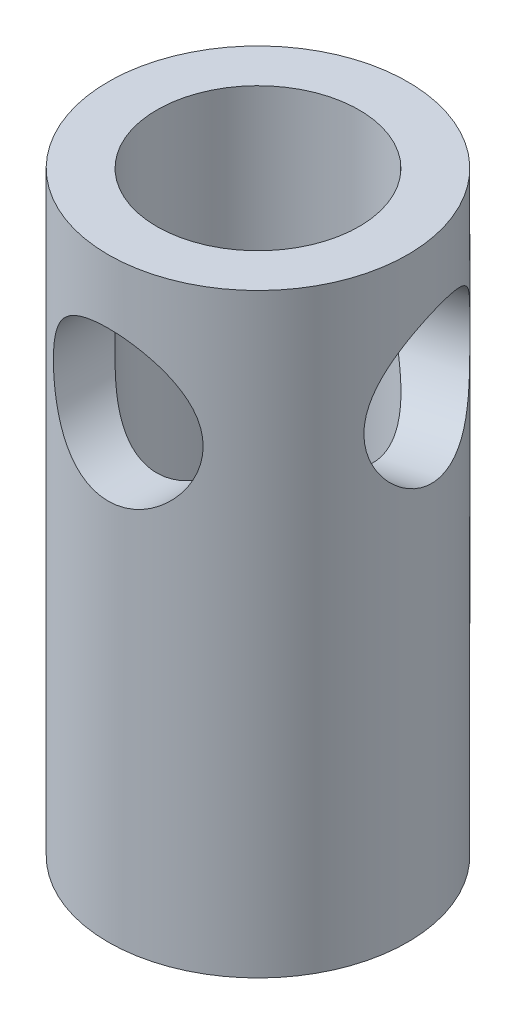
ISO-10303-21;
HEADER;
FILE_DESCRIPTION(('STEP AP214'),'2;1');
FILE_NAME('part.step','',(''),(''),'','','');
FILE_SCHEMA(('AUTOMOTIVE_DESIGN { 1 0 10303 214 1 1 1 1 }'));
ENDSEC;
DATA;
#1=APPLICATION_CONTEXT('core data for automotive mechanical design processes');
#2=APPLICATION_PROTOCOL_DEFINITION('international standard','automotive_design',2000,#1);
#3=PRODUCT_CONTEXT('',#1,'mechanical');
#4=PRODUCT('Part','Part','',(#3));
#5=PRODUCT_RELATED_PRODUCT_CATEGORY('part','',(#4));
#6=PRODUCT_DEFINITION_FORMATION('','',#4);
#7=PRODUCT_DEFINITION_CONTEXT('part definition',#1,'design');
#8=PRODUCT_DEFINITION('design','',#6,#7);
#9=PRODUCT_DEFINITION_SHAPE('','',#8);
#10=(LENGTH_UNIT() NAMED_UNIT(*) SI_UNIT(.MILLI.,.METRE.));
#11=(NAMED_UNIT(*) PLANE_ANGLE_UNIT() SI_UNIT($,.RADIAN.));
#12=(NAMED_UNIT(*) SI_UNIT($,.STERADIAN.) SOLID_ANGLE_UNIT());
#13=UNCERTAINTY_MEASURE_WITH_UNIT(LENGTH_MEASURE(1.E-05),#10,'distance_accuracy_value','');
#14=(GEOMETRIC_REPRESENTATION_CONTEXT(3) GLOBAL_UNCERTAINTY_ASSIGNED_CONTEXT((#13)) GLOBAL_UNIT_ASSIGNED_CONTEXT((#10,
#11,#12)) REPRESENTATION_CONTEXT('',''));
#15=CARTESIAN_POINT('',(0.,0.,0.));
#16=DIRECTION('',(0.,0.,1.));
#17=DIRECTION('',(1.,0.,0.));
#18=AXIS2_PLACEMENT_3D('',#15,#16,#17);
#19=CARTESIAN_POINT('',(0.,7.95,0.));
#20=DIRECTION('',(0.,-1.,0.));
#21=DIRECTION('',(0.,0.,-1.));
#22=AXIS2_PLACEMENT_3D('',#19,#20,#21);
#23=CYLINDRICAL_SURFACE('',#22,4.);
#24=CARTESIAN_POINT('',(0.,7.95,0.));
#25=DIRECTION('',(0.,1.,0.));
#26=DIRECTION('',(0.,0.,1.));
#27=AXIS2_PLACEMENT_3D('',#24,#25,#26);
#28=CIRCLE('',#27,4.);
#29=CARTESIAN_POINT('',(0.,7.95,4.));
#30=VERTEX_POINT('',#29);
#31=EDGE_CURVE('E10',#30,#30,#28,.T.);
#32=ORIENTED_EDGE('',*,*,#31,.F.);
#33=EDGE_LOOP('',(#32));
#34=FACE_BOUND('',#33,.T.);
#35=CARTESIAN_POINT('',(0.,-7.95,0.));
#36=DIRECTION('',(0.,1.,0.));
#37=DIRECTION('',(0.,0.,1.));
#38=AXIS2_PLACEMENT_3D('',#35,#36,#37);
#39=CIRCLE('',#38,4.);
#40=CARTESIAN_POINT('',(0.,-7.95,4.));
#41=VERTEX_POINT('',#40);
#42=EDGE_CURVE('E51',#41,#41,#39,.T.);
#43=ORIENTED_EDGE('',*,*,#42,.T.);
#44=EDGE_LOOP('',(#43));
#45=FACE_BOUND('',#44,.T.);
#46=CARTESIAN_POINT('',(0.,2.25,4.));
#47=CARTESIAN_POINT('',(0.105143925902467,2.25000660463438,3.99999426810082));
#48=CARTESIAN_POINT('',(0.210413199395125,2.25834014624211,3.99580982039513));
#49=CARTESIAN_POINT('',(0.417840470537792,2.29130576068308,3.97948312074314));
#50=CARTESIAN_POINT('',(0.519992173427259,2.31596878599563,3.96732575657839));
#51=CARTESIAN_POINT('',(0.717867089760898,2.38038761723326,3.93632558806751));
#52=CARTESIAN_POINT('',(0.813613605878293,2.42008476849594,3.91750878355075));
#53=CARTESIAN_POINT('',(0.996945233613197,2.51314124272997,3.87491553031523));
#54=CARTESIAN_POINT('',(1.08453098798012,2.56649948849773,3.85113947267051));
#55=CARTESIAN_POINT('',(1.25501563552382,2.68903449897057,3.79912516516124));
#56=CARTESIAN_POINT('',(1.33731042224422,2.75897295847928,3.77070398255074));
#57=CARTESIAN_POINT('',(1.48955888973396,2.91104295849407,3.71319940493486));
#58=CARTESIAN_POINT('',(1.55950316621353,2.99318370354488,3.68411552418069));
#59=CARTESIAN_POINT('',(1.69050400090056,3.17496669904676,3.62597902394695));
#60=CARTESIAN_POINT('',(1.75045067110327,3.27547219669183,3.59710373940264));
#61=CARTESIAN_POINT('',(1.85233645378139,3.48673467197243,3.54571957544641));
#62=CARTESIAN_POINT('',(1.89428842993267,3.5974842574455,3.52320615213979));
#63=CARTESIAN_POINT('',(1.95626488437718,3.81933021084385,3.48915734075617));
#64=CARTESIAN_POINT('',(1.97745171416088,3.93000890413479,3.47704543167427));
#65=CARTESIAN_POINT('',(2.00085398661769,4.15395767555895,3.46363779897055));
#66=CARTESIAN_POINT('',(2.00308817674615,4.26722508174231,3.46233138686576));
#67=CARTESIAN_POINT('',(1.98937457434459,4.47857204863074,3.47021860514497));
#68=CARTESIAN_POINT('',(1.97556911907364,4.5768480624461,3.47817527324027));
#69=CARTESIAN_POINT('',(1.93387969811386,4.76944381874608,3.50152457467701));
#70=CARTESIAN_POINT('',(1.9059912477953,4.86376229061063,3.51691957663553));
#71=CARTESIAN_POINT('',(1.83641956077201,5.04845826513132,3.55374952825482));
#72=CARTESIAN_POINT('',(1.79443013423199,5.13869279757158,3.57531681327997));
#73=CARTESIAN_POINT('',(1.698083375336,5.31126858518002,3.62206808562807));
#74=CARTESIAN_POINT('',(1.64372048762493,5.39360627120018,3.64725369560381));
#75=CARTESIAN_POINT('',(1.51613210982558,5.55904250548645,3.70226315806572));
#76=CARTESIAN_POINT('',(1.44138891673856,5.64091374715232,3.73227020473492));
#77=CARTESIAN_POINT('',(1.27911115748275,5.7914708371818,3.79095246600814));
#78=CARTESIAN_POINT('',(1.19157051314857,5.86015038406777,3.81962703917602));
#79=CARTESIAN_POINT('',(1.0010330116637,5.98537132205945,3.87403974565928));
#80=CARTESIAN_POINT('',(0.897507183198817,6.04120094489148,3.89957968324014));
#81=CARTESIAN_POINT('',(0.680932430977593,6.13419405808602,3.94315762242484));
#82=CARTESIAN_POINT('',(0.567891152530552,6.17137237003033,3.96120157887106));
#83=CARTESIAN_POINT('',(0.345532983321405,6.22295080743335,3.98648667482871));
#84=CARTESIAN_POINT('',(0.236683061096653,6.23898247149356,3.9944987660262));
#85=CARTESIAN_POINT('',(0.0175591998987037,6.25292946226898,4.00146026918207));
#86=CARTESIAN_POINT('',(-0.0927140397398172,6.25085337127894,4.00041397442637));
#87=CARTESIAN_POINT('',(-0.302465943971974,6.22958662316251,3.9898238450687));
#88=CARTESIAN_POINT('',(-0.40211881609986,6.21173493454001,3.98094491376337));
#89=CARTESIAN_POINT('',(-0.596813784603882,6.16152385620976,3.9564434262968));
#90=CARTESIAN_POINT('',(-0.691855371382174,6.12916286709301,3.94082012668824));
#91=CARTESIAN_POINT('',(-0.877777216899145,6.05000306713393,3.90368502827176));
#92=CARTESIAN_POINT('',(-0.968460794011607,6.00281789976743,3.88201763539261));
#93=CARTESIAN_POINT('',(-1.14092272339854,5.89578492870687,3.83487948634835));
#94=CARTESIAN_POINT('',(-1.22269725955318,5.83593173080921,3.80940711133877));
#95=CARTESIAN_POINT('',(-1.38353537857843,5.69847914933857,3.75416442672396));
#96=CARTESIAN_POINT('',(-1.46154415563805,5.61971426310971,3.72421769686998));
#97=CARTESIAN_POINT('',(-1.60371264223771,5.45014969744454,3.6652478321764));
#98=CARTESIAN_POINT('',(-1.66786277142375,5.35934176230416,3.63622534800094));
#99=CARTESIAN_POINT('',(-1.78341582895804,5.16271269165405,3.58102384412979));
#100=CARTESIAN_POINT('',(-1.8340509916005,5.05637746781104,3.55505059178121));
#101=CARTESIAN_POINT('',(-1.91616565186941,4.83497986485007,3.51148144588269));
#102=CARTESIAN_POINT('',(-1.94766983173403,4.71992894706622,3.493874764435));
#103=CARTESIAN_POINT('',(-1.98772337493374,4.49617955423059,3.47123002051604));
#104=CARTESIAN_POINT('',(-1.9981859928109,4.38793149312952,3.4651476693013));
#105=CARTESIAN_POINT('',(-2.0013783087524,4.17110586567095,3.46330709283207));
#106=CARTESIAN_POINT('',(-1.99411569324648,4.06252846252428,3.4675443925278));
#107=CARTESIAN_POINT('',(-1.96385225118662,3.85903299693313,3.48475724102153));
#108=CARTESIAN_POINT('',(-1.94241662868607,3.76379905971052,3.49686188965317));
#109=CARTESIAN_POINT('',(-1.88635071644882,3.57838376115127,3.52742032375305));
#110=CARTESIAN_POINT('',(-1.85171618231984,3.48820403581594,3.54587615139337));
#111=CARTESIAN_POINT('',(-1.76763149060113,3.30875029802693,3.58857060729071));
#112=CARTESIAN_POINT('',(-1.7173422756314,3.21994419634194,3.61311444791841));
#113=CARTESIAN_POINT('',(-1.60430194327478,3.05145092763748,3.66470663269721));
#114=CARTESIAN_POINT('',(-1.54154434248312,2.97176853895778,3.69175627591221));
#115=CARTESIAN_POINT('',(-1.39640665332275,2.81371603529065,3.74924646316184));
#116=CARTESIAN_POINT('',(-1.31256884599452,2.73668179529942,3.77969966613256));
#117=CARTESIAN_POINT('',(-1.13230961246639,2.59747403312946,3.83755504519861));
#118=CARTESIAN_POINT('',(-1.03588144661039,2.53530852106019,3.8649555725239));
#119=CARTESIAN_POINT('',(-0.831863193565891,2.42752727457586,3.91396019133075));
#120=CARTESIAN_POINT('',(-0.724199007553461,2.38203166152706,3.93552192987866));
#121=CARTESIAN_POINT('',(-0.501484202276174,2.31038366448518,3.97002682597974));
#122=CARTESIAN_POINT('',(-0.3864555991782,2.28417630638857,3.98299446726136));
#123=CARTESIAN_POINT('',(-0.22520389298179,2.26220517782852,3.99390923826956));
#124=CARTESIAN_POINT('',(-0.18032375888313,2.25763471826732,3.99618730680502));
#125=CARTESIAN_POINT('',(-0.0903034636101831,2.25153066897183,3.99923393953631));
#126=CARTESIAN_POINT('',(-0.0451632952932569,2.24999716305958,4.00000246206762));
#127=CARTESIAN_POINT('',(0.,2.25,4.));
#128=B_SPLINE_CURVE_WITH_KNOTS('',3,(#46,#47,#48,#49,#50,#51,#52,#53,#54,#55,#56,#57,#58,#59,
#60,#61,#62,#63,#64,#65,#66,#67,#68,#69,#70,#71,#72,#73,#74,#75,#76,#77,#78,#79,#80,#81,#82,#83,
#84,#85,#86,#87,#88,#89,#90,#91,#92,#93,#94,#95,#96,#97,#98,#99,#100,#101,#102,#103,#104,#105,
#106,#107,#108,#109,#110,#111,#112,#113,#114,#115,#116,#117,#118,#119,#120,#121,#122,#123,#124,
#125,#126,#127),.UNSPECIFIED.,.T.,.F.,(4,2,2,2,2,2,2,2,2,2,2,2,2,2,2,2,2,2,2,2,2,2,2,2,2,2,2,2,
2,2,2,2,2,2,2,2,2,2,2,2,4),(0.,0.315248514840585,0.631096299418395,0.945724310984597,
1.26032752116314,1.59396351743618,1.92785247530807,2.28763452861505,2.64715895796562,
2.98516024280459,3.32282714658041,3.62011424818641,3.91749607851357,4.22180480336975,
4.52625042520444,4.86929882667757,5.21251069197373,5.57166044428881,5.93052433824559,
6.25966580942691,6.58865129022952,6.89213813012244,7.19565843261863,7.50785712055797,
7.82018901496678,8.16319221288838,8.50643177230863,8.86629364323451,9.22569023890901,
9.55058615006093,9.87534119729357,10.1691586049771,10.463070575767,10.7767291356057,
11.0905512228726,11.4425048551434,11.7946476676249,12.1492802732705,12.502898172423,
12.6383056026783,12.7737167702213),.UNSPECIFIED.);
#129=CARTESIAN_POINT('',(0.,2.25,4.));
#130=VERTEX_POINT('',#129);
#131=EDGE_CURVE('E69',#130,#130,#128,.T.);
#132=ORIENTED_EDGE('',*,*,#131,.F.);
#133=EDGE_LOOP('',(#132));
#134=FACE_BOUND('',#133,.T.);
#135=CARTESIAN_POINT('',(3.86370330515628,4.25,1.03527618041007));
#136=CARTESIAN_POINT('',(3.86371102087062,4.14578679452566,1.03526540371715));
#137=CARTESIAN_POINT('',(3.86619292046601,4.0414378234662,1.02611944858652));
#138=CARTESIAN_POINT('',(3.87556408657203,3.8359448227694,0.990114254791761));
#139=CARTESIAN_POINT('',(3.88246261337344,3.73480799675224,0.963217795191884));
#140=CARTESIAN_POINT('',(3.89909622190156,3.53909684355307,0.893484190582766));
#141=CARTESIAN_POINT('',(3.9088161635429,3.44449074115075,0.850731799135298));
#142=CARTESIAN_POINT('',(3.92915843649209,3.26315154952385,0.751190224046072));
#143=CARTESIAN_POINT('',(3.9397808165973,3.17641888656323,0.694400281037419));
#144=CARTESIAN_POINT('',(3.96071985018198,3.00538855686662,0.563421465896721));
#145=CARTESIAN_POINT('',(3.97093902801014,2.92188173240823,0.488183885668546));
#146=CARTESIAN_POINT('',(3.98756907626202,2.7671832194294,0.325541348854486));
#147=CARTESIAN_POINT('',(3.99397805092837,2.69599767379603,0.2381303620697));
#148=CARTESIAN_POINT('',(4.00093917152259,2.5632656988115,0.0470635210164524));
#149=CARTESIAN_POINT('',(4.00106740390368,2.50269246457669,-0.0572901826164385));
#150=CARTESIAN_POINT('',(3.99205963603809,2.39971829321291,-0.274251917119272));
#151=CARTESIAN_POINT('',(3.98292949469634,2.3573058876492,-0.38685468598722));
#152=CARTESIAN_POINT('',(3.95494384558051,2.29499067746882,-0.608250536157227));
#153=CARTESIAN_POINT('',(3.93682656600741,2.2737009473079,-0.716744591289472));
#154=CARTESIAN_POINT('',(3.89106237364494,2.24966776263097,-0.933756781348021));
#155=CARTESIAN_POINT('',(3.86342123756026,2.24691308640372,-1.04227486191893));
#156=CARTESIAN_POINT('',(3.80227096920882,2.25949334794514,-1.2462294283464));
#157=CARTESIAN_POINT('',(3.76948114907834,2.27327603104364,-1.3419828672255));
#158=CARTESIAN_POINT('',(3.69806544967973,2.31576168780812,-1.52781639343723));
#159=CARTESIAN_POINT('',(3.6594391338556,2.34446577795212,-1.61789605567016));
#160=CARTESIAN_POINT('',(3.57762960520259,2.41616513217995,-1.79162562402635));
#161=CARTESIAN_POINT('',(3.53439073954532,2.45935262634422,-1.87516932870234));
#162=CARTESIAN_POINT('',(3.44596339120441,2.5585268324029,-2.03311113953867));
#163=CARTESIAN_POINT('',(3.40077421523963,2.61451812660468,-2.10750595674173));
#164=CARTESIAN_POINT('',(3.30646252097167,2.74379070306606,-2.25288809442221));
#165=CARTESIAN_POINT('',(3.25737197870763,2.81820605665203,-2.32288856355735));
#166=CARTESIAN_POINT('',(3.16267831901809,2.97917944986035,-2.45026073294161));
#167=CARTESIAN_POINT('',(3.11707790100349,3.06574674454812,-2.50762272120002));
#168=CARTESIAN_POINT('',(3.0300287756483,3.25529638484818,-2.6122500868672));
#169=CARTESIAN_POINT('',(2.98902761253641,3.35897204610842,-2.65864296463001));
#170=CARTESIAN_POINT('',(2.91901414684091,3.575875342718,-2.73533909977255));
#171=CARTESIAN_POINT('',(2.88998933995477,3.68909286603513,-2.76565914797881));
#172=CARTESIAN_POINT('',(2.84935024247918,3.91242902256558,-2.80748941291858));
#173=CARTESIAN_POINT('',(2.83653851667412,4.0220822380871,-2.82029982052351));
#174=CARTESIAN_POINT('',(2.8259580665442,4.24280268303309,-2.83090645998245));
#175=CARTESIAN_POINT('',(2.82817871609314,4.3538688582396,-2.82871329758904));
#176=CARTESIAN_POINT('',(2.846258774587,4.56130783715744,-2.81050365458268));
#177=CARTESIAN_POINT('',(2.8605996528599,4.65795890221578,-2.79602556479373));
#178=CARTESIAN_POINT('',(2.89944305922737,4.84673557254199,-2.75572262459278));
#179=CARTESIAN_POINT('',(2.92394887801698,4.93885970149348,-2.72989409954455));
#180=CARTESIAN_POINT('',(2.982327820893,5.12082266180512,-2.66602087438678));
#181=CARTESIAN_POINT('',(3.01658222634056,5.21035803370605,-2.62746578423145));
#182=CARTESIAN_POINT('',(3.09126834700151,5.38093854307904,-2.5391734882802));
#183=CARTESIAN_POINT('',(3.13170323251408,5.46197928703051,-2.48943053742219));
#184=CARTESIAN_POINT('',(3.22153389743431,5.62395753504266,-2.37230292340345));
#185=CARTESIAN_POINT('',(3.27141673768222,5.70359430141778,-2.30348484350489));
#186=CARTESIAN_POINT('',(3.37235731983305,5.84882447600473,-2.15300102291744));
#187=CARTESIAN_POINT('',(3.42341545217732,5.91441314052684,-2.07133095853565));
#188=CARTESIAN_POINT('',(3.52475884471552,6.03114745183271,-1.89387776341177));
#189=CARTESIAN_POINT('',(3.5749881438686,6.08186623616677,-1.79777904834872));
#190=CARTESIAN_POINT('',(3.66983923050507,6.16427580796961,-1.59522498798561));
#191=CARTESIAN_POINT('',(3.71446591454191,6.1959833036841,-1.48877883254248));
#192=CARTESIAN_POINT('',(3.79155053624255,6.23673712748514,-1.2788609851481));
#193=CARTESIAN_POINT('',(3.82474929719162,6.24759574866428,-1.17601250241759));
#194=CARTESIAN_POINT('',(3.8826997496973,6.25168653399567,-0.967636069694246));
#195=CARTESIAN_POINT('',(3.90745439483326,6.24492486852887,-0.862109070496669));
#196=CARTESIAN_POINT('',(3.94663786679282,6.21516717568359,-0.65883843312983));
#197=CARTESIAN_POINT('',(3.9616396212675,6.19327026269095,-0.561040121311743));
#198=CARTESIAN_POINT('',(3.98413359727553,6.13534604019333,-0.36884587261212));
#199=CARTESIAN_POINT('',(3.99162474134253,6.09931670429309,-0.274450425775012));
#200=CARTESIAN_POINT('',(4.00018597306019,6.0125457450086,-0.0874575230147427));
#201=CARTESIAN_POINT('',(4.00096772615297,5.96124078024814,0.00489035413010362));
#202=CARTESIAN_POINT('',(3.99686622495523,5.84608471188191,0.181260401945646));
#203=CARTESIAN_POINT('',(3.99198036368477,5.78222784589843,0.265278721898033));
#204=CARTESIAN_POINT('',(3.97766393359422,5.63640336444059,0.431019801140244));
#205=CARTESIAN_POINT('',(3.96782946545322,5.55326581919972,0.511681965594132));
#206=CARTESIAN_POINT('',(3.9461359538813,5.37510777169391,0.658425447588592));
#207=CARTESIAN_POINT('',(3.93427513504283,5.28007686863949,0.724493861271516));
#208=CARTESIAN_POINT('',(3.9109984539019,5.07669110586976,0.841292612553644));
#209=CARTESIAN_POINT('',(3.89960849823722,4.96801008926473,0.891472256560198));
#210=CARTESIAN_POINT('',(3.88542265032005,4.79942188036906,0.950733368834909));
#211=CARTESIAN_POINT('',(3.88117974759335,4.74235217940932,0.967810777901845));
#212=CARTESIAN_POINT('',(3.87394441718085,4.62676744249981,0.996380961168546));
#213=CARTESIAN_POINT('',(3.87095111542801,4.56825344724575,1.00787763987982));
#214=CARTESIAN_POINT('',(3.86705376814083,4.46639921075271,1.02271016996935));
#215=CARTESIAN_POINT('',(3.86580273223159,4.42326694274993,1.02741589583501));
#216=CARTESIAN_POINT('',(3.86412586674217,4.33676430690711,1.03370124930387));
#217=CARTESIAN_POINT('',(3.86370009236654,4.2933939233333,1.0352806677779));
#218=CARTESIAN_POINT('',(3.86370330515628,4.25,1.03527618041007));
#219=B_SPLINE_CURVE_WITH_KNOTS('',3,(#135,#136,#137,#138,#139,#140,#141,#142,#143,#144,#145,
#146,#147,#148,#149,#150,#151,#152,#153,#154,#155,#156,#157,#158,#159,#160,#161,#162,#163,#164,
#165,#166,#167,#168,#169,#170,#171,#172,#173,#174,#175,#176,#177,#178,#179,#180,#181,#182,#183,
#184,#185,#186,#187,#188,#189,#190,#191,#192,#193,#194,#195,#196,#197,#198,#199,#200,#201,#202,
#203,#204,#205,#206,#207,#208,#209,#210,#211,#212,#213,#214,#215,#216,#217,#218),.UNSPECIFIED.,
.T.,.F.,(4,2,2,2,2,2,2,2,2,2,2,2,2,2,2,2,2,2,2,2,2,2,2,2,2,2,2,2,2,2,2,2,2,2,2,2,2,2,2,2,2,4),
(0.,0.312464245189432,0.625585785649609,0.937057191861536,1.24854545093097,1.58572462503713,
1.92307142172809,2.28315784481594,2.64301653931849,2.97726969939937,3.31132047376147,
3.61632194973143,3.92134625038977,4.2305906946636,4.5399459870461,4.87854382917848,
5.21740096495904,5.57777683462963,5.93777548427476,6.2692458171249,6.60048186380813,
6.89548366852118,7.19058104876193,7.49934592816242,7.80826972444161,8.15613487165293,
8.50411729960471,8.86128362829998,9.2181355962161,9.5422454078304,9.8662417359201,
10.1688884974705,10.4715786702809,10.7872150144301,11.102996602055,11.450204837042,
11.7977188569438,12.1562149808128,12.3351395323571,12.5139387197526,12.6440387634036,
12.7741475095882),.UNSPECIFIED.);
#220=CARTESIAN_POINT('',(3.86370330515628,4.25,1.03527618041007));
#221=VERTEX_POINT('',#220);
#222=EDGE_CURVE('E70',#221,#221,#219,.T.);
#223=ORIENTED_EDGE('',*,*,#222,.F.);
#224=EDGE_LOOP('',(#223));
#225=FACE_BOUND('',#224,.T.);
#226=ADVANCED_FACE('F37',(#34,#45,#134,#225),#23,.T.);
#227=CARTESIAN_POINT('',(0.,7.95,0.));
#228=DIRECTION('',(0.,-1.,0.));
#229=DIRECTION('',(0.,0.,-1.));
#230=AXIS2_PLACEMENT_3D('',#227,#228,#229);
#231=CYLINDRICAL_SURFACE('',#230,2.7);
#232=CARTESIAN_POINT('',(-2.,4.25,1.81383571472171));
#233=CARTESIAN_POINT('',(-1.9999917320634,4.15614900650679,1.81385259374432));
#234=CARTESIAN_POINT('',(-1.99331889502685,4.06224934524229,1.82128576936993));
#235=CARTESIAN_POINT('',(-1.96734478496187,3.87815835755431,1.8492922510451));
#236=CARTESIAN_POINT('',(-1.9480084944221,3.78797805323948,1.86990198971001));
#237=CARTESIAN_POINT('',(-1.89856306425923,3.61480352182116,1.92007001829865));
#238=CARTESIAN_POINT('',(-1.86859941525244,3.53173018565242,1.94950666373212));
#239=CARTESIAN_POINT('',(-1.79911190968265,3.37205753647019,2.01381184943245));
#240=CARTESIAN_POINT('',(-1.75958877323399,3.29545773639269,2.04867998047613));
#241=CARTESIAN_POINT('',(-1.66283123751815,3.13395243047751,2.12830119610996));
#242=CARTESIAN_POINT('',(-1.60363097286909,3.05050649349165,2.1736260971972));
#243=CARTESIAN_POINT('',(-1.47312183964341,2.89340427838426,2.2641201982832));
#244=CARTESIAN_POINT('',(-1.40179569697763,2.81976223718393,2.30928908103428));
#245=CARTESIAN_POINT('',(-1.23225227345916,2.66988859930554,2.40474252382404));
#246=CARTESIAN_POINT('',(-1.13150522251343,2.59599792341079,2.45428522873956));
#247=CARTESIAN_POINT('',(-0.91465170099806,2.46696232234691,2.54303827610814));
#248=CARTESIAN_POINT('',(-0.79858112560571,2.41177463146847,2.58227214362214));
#249=CARTESIAN_POINT('',(-0.590497143104423,2.33697007019845,2.63614006627441));
#250=CARTESIAN_POINT('',(-0.501508062577588,2.31166116423312,2.6546173884125));
#251=CARTESIAN_POINT('',(-0.319540799660604,2.27351076748558,2.68259900330645));
#252=CARTESIAN_POINT('',(-0.226566104750938,2.26065860033084,2.69211097985232));
#253=CARTESIAN_POINT('',(-0.0390078562110023,2.24816732093734,2.70135455976072));
#254=CARTESIAN_POINT('',(0.0555790978869057,2.24856085196418,2.70106200041295));
#255=CARTESIAN_POINT('',(0.243219644764626,2.2626148459217,2.69066493199401));
#256=CARTESIAN_POINT('',(0.336272860389506,2.2762785239811,2.68055804507992));
#257=CARTESIAN_POINT('',(0.515247594925046,2.31540711421237,2.65188237491887));
#258=CARTESIAN_POINT('',(0.601302116258901,2.34047958703706,2.63359530261406));
#259=CARTESIAN_POINT('',(0.767710995973835,2.40108947676524,2.58998614142156));
#260=CARTESIAN_POINT('',(0.848064141461049,2.43662911218828,2.56466256120744));
#261=CARTESIAN_POINT('',(1.0103561536018,2.52128607111641,2.50548084953365));
#262=CARTESIAN_POINT('',(1.09150837935609,2.57146287008996,2.47099241535943));
#263=CARTESIAN_POINT('',(1.2446238781841,2.68161765151992,2.39752749309577));
#264=CARTESIAN_POINT('',(1.31657877764605,2.74160445373984,2.35854697576269));
#265=CARTESIAN_POINT('',(1.46387974775714,2.88274270607748,2.27062967809251));
#266=CARTESIAN_POINT('',(1.53717881202054,2.96574270908305,2.22122777940312));
#267=CARTESIAN_POINT('',(1.66947784239892,3.14315856739454,2.12357982182544));
#268=CARTESIAN_POINT('',(1.72847292495247,3.23757830509927,2.07533416274391));
#269=CARTESIAN_POINT('',(1.82036868799738,3.41681542206399,1.99479069707133));
#270=CARTESIAN_POINT('',(1.85614174346335,3.4995967597418,1.96125597113076));
#271=CARTESIAN_POINT('',(1.91672930218108,3.67170303643723,1.90209025172728));
#272=CARTESIAN_POINT('',(1.94156856759263,3.76101264967463,1.87644143891669));
#273=CARTESIAN_POINT('',(1.97537916551719,3.92792686225673,1.8407538632752));
#274=CARTESIAN_POINT('',(1.98642659791585,4.00466980163995,1.82871364124177));
#275=CARTESIAN_POINT('',(1.99947576036664,4.15979715334291,1.8144419098912));
#276=CARTESIAN_POINT('',(2.0014874069076,4.23817967127997,1.81219964769691));
#277=CARTESIAN_POINT('',(1.99632076097772,4.3942206707404,1.81788710827564));
#278=CARTESIAN_POINT('',(1.98914553577135,4.47187938520529,1.82581343601504));
#279=CARTESIAN_POINT('',(1.96614778812793,4.62448860936602,1.85055089445555));
#280=CARTESIAN_POINT('',(1.95031119943299,4.69943450171241,1.86737647628691));
#281=CARTESIAN_POINT('',(1.90318130285068,4.87362621741646,1.91557294511678));
#282=CARTESIAN_POINT('',(1.8682748067576,4.97101685546239,1.95005445986674));
#283=CARTESIAN_POINT('',(1.7854137496275,5.15703722798737,2.02619502058697));
#284=CARTESIAN_POINT('',(1.73743284466174,5.24564877635101,2.0678684949615));
#285=CARTESIAN_POINT('',(1.62775613188464,5.41664484973551,2.15534224111981));
#286=CARTESIAN_POINT('',(1.56565441215505,5.49872096679417,2.20123403183716));
#287=CARTESIAN_POINT('',(1.42937154177416,5.65265971947556,2.29207427404587));
#288=CARTESIAN_POINT('',(1.35519727051816,5.72452812841256,2.33702324641923));
#289=CARTESIAN_POINT('',(1.19524165301487,5.85691006096302,2.4227310853692));
#290=CARTESIAN_POINT('',(1.10946989229613,5.91743286436167,2.46349336387426));
#291=CARTESIAN_POINT('',(0.927115051306224,6.02528725516665,2.53773866608732));
#292=CARTESIAN_POINT('',(0.830541771227978,6.07263066627644,2.57122820845561));
#293=CARTESIAN_POINT('',(0.643784516505257,6.14578765355991,2.62363614078253));
#294=CARTESIAN_POINT('',(0.554864110117981,6.17378103249729,2.64399627390631));
#295=CARTESIAN_POINT('',(0.372473039813625,6.21724014863435,2.67578246545194));
#296=CARTESIAN_POINT('',(0.279005407340552,6.23271411389194,2.68721439153313));
#297=CARTESIAN_POINT('',(0.0898352015379786,6.25024416702411,2.70017427675916));
#298=CARTESIAN_POINT('',(-0.0058732336043636,6.25225987653479,2.70167243184367));
#299=CARTESIAN_POINT('',(-0.196219781105467,6.242631663163,2.69454461477161));
#300=CARTESIAN_POINT('',(-0.290857760430397,6.23098606091255,2.68591739791566));
#301=CARTESIAN_POINT('',(-0.471947303458937,6.19560866447585,2.65993572272031));
#302=CARTESIAN_POINT('',(-0.55857523776012,6.17245620453074,2.64300005175785));
#303=CARTESIAN_POINT('',(-0.72641094539765,6.11552617563954,2.60188417124869));
#304=CARTESIAN_POINT('',(-0.8076175684915,6.08174636051196,2.57770243023515));
#305=CARTESIAN_POINT('',(-0.971031673223115,6.00105706337816,2.5209711803658));
#306=CARTESIAN_POINT('',(-1.05255534824597,5.95318443153634,2.48783339028287));
#307=CARTESIAN_POINT('',(-1.20673102425869,5.84766774732295,2.41682002328358));
#308=CARTESIAN_POINT('',(-1.2793760740916,5.79001612214037,2.37894078060933));
#309=CARTESIAN_POINT('',(-1.42833400850366,5.65423566781186,2.29316022559046));
#310=CARTESIAN_POINT('',(-1.50269338863165,5.5742991331472,2.24472729093366));
#311=CARTESIAN_POINT('',(-1.6376615868979,5.40323404343582,2.14824102406382));
#312=CARTESIAN_POINT('',(-1.69826162354489,5.31209839774733,2.10018795306186));
#313=CARTESIAN_POINT('',(-1.79590795762044,5.13497857860341,2.01696030674043));
#314=CARTESIAN_POINT('',(-1.8351894567568,5.05061633410828,1.9809679244596));
#315=CARTESIAN_POINT('',(-1.90224274141206,4.87472599114602,1.9166724561418));
#316=CARTESIAN_POINT('',(-1.93004161518193,4.78321537023345,1.88835132814113));
#317=CARTESIAN_POINT('',(-1.96719451924347,4.61797400676901,1.84950948631536));
#318=CARTESIAN_POINT('',(-1.97942483151804,4.54553317956429,1.8363067387748));
#319=CARTESIAN_POINT('',(-1.9958266064697,4.39873702601106,1.81846767300588));
#320=CARTESIAN_POINT('',(-2.00000655294644,4.32438379888474,1.81382233685774));
#321=CARTESIAN_POINT('',(-2.,4.25,1.81383571472171));
#322=B_SPLINE_CURVE_WITH_KNOTS('',3,(#232,#233,#234,#235,#236,#237,#238,#239,#240,#241,#242,
#243,#244,#245,#246,#247,#248,#249,#250,#251,#252,#253,#254,#255,#256,#257,#258,#259,#260,#261,
#262,#263,#264,#265,#266,#267,#268,#269,#270,#271,#272,#273,#274,#275,#276,#277,#278,#279,#280,
#281,#282,#283,#284,#285,#286,#287,#288,#289,#290,#291,#292,#293,#294,#295,#296,#297,#298,#299,
#300,#301,#302,#303,#304,#305,#306,#307,#308,#309,#310,#311,#312,#313,#314,#315,#316,#317,#318,
#319,#320,#321),.UNSPECIFIED.,.T.,.F.,(4,2,2,2,2,2,2,2,2,2,2,2,2,2,2,2,2,2,2,2,2,2,2,2,2,2,2,2,
2,2,2,2,2,2,2,2,2,2,2,2,2,2,2,2,4),(0.,0.281176139648857,0.563133101053975,0.841370233367737,
1.11958641265616,1.45414631224104,1.78918686992989,2.19014273383261,2.59017549815409,
2.8720173704978,3.15361746875202,3.43591160503812,3.71827415341188,3.9915830970141,
4.26495001030171,4.5681963065427,4.87171675301589,5.23408053923755,5.59656786741009,
5.88429217317885,6.17136146369632,6.40572256844516,6.63982640636053,6.87385210329483,
7.10825899691362,7.43362202435306,7.75964554385813,8.09660045436055,8.4333640232,
8.76985093333033,9.10603498897227,9.39106767428718,9.6759128767864,9.96161230847498,
10.2473468645182,10.5199652713426,10.7926413371294,11.092075870843,11.3917433529629,
11.7486957900092,12.1058754049334,12.4042530705983,12.7019227677571,12.9250107183855,
13.1478634410298),.UNSPECIFIED.);
#323=CARTESIAN_POINT('',(-2.,4.25,1.81383571472171));
#324=VERTEX_POINT('',#323);
#325=EDGE_CURVE('E62',#324,#324,#322,.T.);
#326=ORIENTED_EDGE('',*,*,#325,.T.);
#327=EDGE_LOOP('',(#326));
#328=FACE_BOUND('',#327,.T.);
#329=CARTESIAN_POINT('',(0.,7.95,0.));
#330=DIRECTION('',(0.,1.,0.));
#331=DIRECTION('',(0.,0.,1.));
#332=AXIS2_PLACEMENT_3D('',#329,#330,#331);
#333=CIRCLE('',#332,2.7);
#334=CARTESIAN_POINT('',(0.,7.95,2.7));
#335=VERTEX_POINT('',#334);
#336=EDGE_CURVE('E57',#335,#335,#333,.T.);
#337=ORIENTED_EDGE('',*,*,#336,.T.);
#338=EDGE_LOOP('',(#337));
#339=FACE_BOUND('',#338,.T.);
#340=CARTESIAN_POINT('',(0.,-7.95,0.));
#341=DIRECTION('',(0.,1.,0.));
#342=DIRECTION('',(0.,0.,1.));
#343=AXIS2_PLACEMENT_3D('',#340,#341,#342);
#344=CIRCLE('',#343,2.7);
#345=CARTESIAN_POINT('',(0.,-7.95,2.7));
#346=VERTEX_POINT('',#345);
#347=EDGE_CURVE('E60',#346,#346,#344,.T.);
#348=ORIENTED_EDGE('',*,*,#347,.F.);
#349=EDGE_LOOP('',(#348));
#350=FACE_BOUND('',#349,.T.);
#351=CARTESIAN_POINT('',(2.26966885170023,4.25,1.46239642492101));
#352=CARTESIAN_POINT('',(2.26968301568465,4.15614900650679,1.462384070095));
#353=CARTESIAN_POINT('',(2.27513585468284,4.06224934524229,1.45401475704928));
#354=CARTESIAN_POINT('',(2.29546544427197,3.87815835755431,1.42167708247879));
#355=CARTESIAN_POINT('',(2.31036832286814,3.78797805323948,1.39766546718074));
#356=CARTESIAN_POINT('',(2.34602949831648,3.61480352182116,1.33692040794046));
#357=CARTESIAN_POINT('',(2.36670795135627,3.53173018565242,1.30035898105282));
#358=CARTESIAN_POINT('',(2.41083730115039,3.37205753647019,1.21659579806046));
#359=CARTESIAN_POINT('',(2.43428798900483,3.29545773639269,1.16939484344752));
#360=CARTESIAN_POINT('',(2.48615348450562,3.13395243047751,1.05532675381125));
#361=CARTESIAN_POINT('',(2.5146118210735,3.05050649349165,0.986412741644811));
#362=CARTESIAN_POINT('',(2.56824416120065,2.89340427838426,0.836929002465029));
#363=CARTESIAN_POINT('',(2.59341338745894,2.81976223718393,0.756342672072599));
#364=CARTESIAN_POINT('',(2.64173326607931,2.66988859930554,0.567871131704047));
#365=CARTESIAN_POINT('',(2.66351258873876,2.59599792341079,0.45773435769507));
#366=CARTESIAN_POINT('',(2.6931156279882,2.46696232234691,0.225298961771771));
#367=CARTESIAN_POINT('',(2.70097135839762,2.41177463146848,0.103028923202418));
#368=CARTESIAN_POINT('',(2.69914767844388,2.33697007019845,-0.111906813835175));
#369=CARTESIAN_POINT('',(2.69396333225122,2.31166116423312,-0.202645947845594));
#370=CARTESIAN_POINT('',(2.67389490351046,2.27351076748558,-0.38565500148352));
#371=CARTESIAN_POINT('',(2.65901914555996,2.26065860033084,-0.477923541174755));
#372=CARTESIAN_POINT('',(2.61940411133264,2.24816732093734,-0.661483311898242));
#373=CARTESIAN_POINT('',(2.59464061556413,2.24856085196418,-0.752771573760403));
#374=CARTESIAN_POINT('',(2.53603287149518,2.2626148459217,-0.931327464728543));
#375=CARTESIAN_POINT('',(2.50218642398973,2.2762785239811,-1.0185941140998));
#376=CARTESIAN_POINT('',(2.42816578370505,2.31540711421237,-1.18404862287215));
#377=CARTESIAN_POINT('',(2.38822927924024,2.34047958703706,-1.26243786490581));
#378=CARTESIAN_POINT('',(2.30303627683719,2.40108947676524,-1.41188961808873));
#379=CARTESIAN_POINT('',(2.25777865230829,2.43662911218828,-1.4829505716888));
#380=CARTESIAN_POINT('',(2.15860924494855,2.52128607111641,-1.62439526351302));
#381=CARTESIAN_POINT('',(2.10429223409373,2.57146287008996,-1.69385603062988));
#382=CARTESIAN_POINT('',(1.99370136115587,2.68161765151992,-1.82274012432418));
#383=CARTESIAN_POINT('',(1.93742577437255,2.74160445373984,-1.88215431976876));
#384=CARTESIAN_POINT('',(1.81437988954856,2.88274270607748,-2.0016814600055));
#385=CARTESIAN_POINT('',(1.7476901259172,2.96574270908305,-2.0596967669753));
#386=CARTESIAN_POINT('',(1.61912793309801,3.14315856739454,-2.16221466607431));
#387=CARTESIAN_POINT('',(1.55725715405258,3.23757830509927,-2.20671264452302));
#388=CARTESIAN_POINT('',(1.45567376678035,3.41681542206399,-2.27463095250002));
#389=CARTESIAN_POINT('',(1.41402296086073,3.4995967597418,-2.30050564491415));
#390=CARTESIAN_POINT('',(1.34119205036552,3.67170303643723,-2.34371551763261));
#391=CARTESIAN_POINT('',(1.30998832470325,3.76101264967463,-2.36107000436002));
#392=CARTESIAN_POINT('',(1.26676594704431,3.92792686225673,-2.38449190984807));
#393=CARTESIAN_POINT('',(1.25227669972371,4.00466980163995,-2.39204667134661));
#394=CARTESIAN_POINT('',(1.23511389406143,4.15979715334291,-2.40095739848915));
#395=CARTESIAN_POINT('',(1.23242738266184,4.23817967127997,-2.40232015967643));
#396=CARTESIAN_POINT('',(1.23925827408679,4.3942206707404,-2.39880158605352));
#397=CARTESIAN_POINT('',(1.24877160369421,4.47187938520529,-2.39392233529392));
#398=CARTESIAN_POINT('',(1.27861840876324,4.62448860936602,-2.3781107422705));
#399=CARTESIAN_POINT('',(1.29896948356019,4.69943450171241,-2.36716855327263));
#400=CARTESIAN_POINT('',(1.35772181236812,4.87362621741645,-2.3341187330133));
#401=CARTESIAN_POINT('',(1.40006286398135,4.97101685546239,-2.30932611965301));
#402=CARTESIAN_POINT('',(1.49505501769176,5.15703722798736,-2.24899511179662));
#403=CARTESIAN_POINT('',(1.5477268748677,5.24564877635101,-2.21343500536519));
#404=CARTESIAN_POINT('',(1.66060644747522,5.41664484973551,-2.13013530740354));
#405=CARTESIAN_POINT('',(1.7210076211434,5.49872096679417,-2.08202732191127));
#406=CARTESIAN_POINT('',(1.84402515953496,5.65265971947556,-1.9738993624749));
#407=CARTESIAN_POINT('',(1.90664024687319,5.72452812841256,-1.91388616833057));
#408=CARTESIAN_POINT('',(2.03082722221138,5.85691006096302,-1.78156372735896));
#409=CARTESIAN_POINT('',(2.09239992496379,5.91743286436167,-1.70926462251333));
#410=CARTESIAN_POINT('',(2.21131228566686,6.02528725516665,-1.55233947027447));
#411=CARTESIAN_POINT('',(2.26865570368326,6.07263066627644,-1.46772457629413));
#412=CARTESIAN_POINT('',(2.36761421335354,6.14578765355991,-1.30089509171126));
#413=CARTESIAN_POINT('',(2.41029488643577,6.17378103249729,-1.22027416491093));
#414=CARTESIAN_POINT('',(2.48820427242047,6.21724014863435,-1.05232479136273));
#415=CARTESIAN_POINT('',(2.52343786845119,6.23271411389194,-0.965000791426909));
#416=CARTESIAN_POINT('',(2.58491700832442,6.25024416702411,-0.785630669196623));
#417=CARTESIAN_POINT('',(2.61113528080414,6.25225987653479,-0.693571170967312));
#418=CARTESIAN_POINT('',(2.65351564987197,6.242631663163,-0.507865709982783));
#419=CARTESIAN_POINT('',(2.66967650974112,6.23098606091255,-0.414219553576473));
#420=CARTESIAN_POINT('',(2.69144956126437,6.19560866447585,-0.232575934730094));
#421=CARTESIAN_POINT('',(2.69751191853124,6.17245620453074,-0.144516501523835));
#422=CARTESIAN_POINT('',(2.70123610526167,6.11552617563954,0.028241915988687));
#423=CARTESIAN_POINT('',(2.69889615773721,6.08174636051196,0.1129401856188));
#424=CARTESIAN_POINT('',(2.68639266087367,6.00105706337816,0.285469217677631));
#425=CARTESIAN_POINT('',(2.67548389332909,5.95318443153634,0.372791732022277));
#426=CARTESIAN_POINT('',(2.64679384937638,5.84766774732295,0.540093611104805));
#427=CARTESIAN_POINT('',(2.62900723302623,5.79001612214037,0.620067210308627));
#428=CARTESIAN_POINT('',(2.58470272988506,5.65423566781186,0.786151167526255));
#429=CARTESIAN_POINT('',(2.55716573121624,5.5742991331472,0.87051217911812));
#430=CARTESIAN_POINT('',(2.49889949435892,5.40323404343582,1.02585393100795));
#431=CARTESIAN_POINT('',(2.46816823566377,5.31209839774733,1.09682612143032));
#432=CARTESIAN_POINT('',(2.41304923356385,5.13497857860341,1.21268613730338));
#433=CARTESIAN_POINT('',(2.38845006206579,5.05061633410828,1.25994466582743));
#434=CARTESIAN_POINT('',(2.34370007580974,4.87472599114602,1.3413540569279));
#435=CARTESIAN_POINT('',(2.3235388448083,4.78321537023345,1.37553575434931));
#436=CARTESIAN_POINT('',(2.29563638580014,4.61797400676901,1.42147571231537));
#437=CARTESIAN_POINT('',(2.28604894871696,4.54553317956429,1.43670640931613));
#438=CARTESIAN_POINT('',(2.27306282610486,4.39873702601106,1.45716639730675));
#439=CARTESIAN_POINT('',(2.26965762570327,4.32438379888474,1.46240621702718));
#440=CARTESIAN_POINT('',(2.26966885170023,4.25,1.46239642492101));
#441=B_SPLINE_CURVE_WITH_KNOTS('',3,(#351,#352,#353,#354,#355,#356,#357,#358,#359,#360,#361,
#362,#363,#364,#365,#366,#367,#368,#369,#370,#371,#372,#373,#374,#375,#376,#377,#378,#379,#380,
#381,#382,#383,#384,#385,#386,#387,#388,#389,#390,#391,#392,#393,#394,#395,#396,#397,#398,#399,
#400,#401,#402,#403,#404,#405,#406,#407,#408,#409,#410,#411,#412,#413,#414,#415,#416,#417,#418,
#419,#420,#421,#422,#423,#424,#425,#426,#427,#428,#429,#430,#431,#432,#433,#434,#435,#436,#437,
#438,#439,#440),.UNSPECIFIED.,.T.,.F.,(4,2,2,2,2,2,2,2,2,2,2,2,2,2,2,2,2,2,2,2,2,2,2,2,2,2,2,2,
2,2,2,2,2,2,2,2,2,2,2,2,2,2,2,2,4),(0.,0.281176139648857,0.563133101053975,0.841370233367737,
1.11958641265616,1.45414631224104,1.78918686992989,2.19014273383261,2.59017549815409,
2.8720173704978,3.15361746875202,3.43591160503812,3.71827415341188,3.9915830970141,
4.26495001030171,4.5681963065427,4.87171675301589,5.23408053923755,5.59656786741009,
5.88429217317885,6.17136146369631,6.40572256844515,6.63982640636052,6.87385210329483,
7.10825899691361,7.43362202435306,7.75964554385813,8.09660045436055,8.4333640232,
8.76985093333032,9.10603498897227,9.39106767428718,9.6759128767864,9.96161230847498,
10.2473468645182,10.5199652713426,10.7926413371294,11.092075870843,11.3917433529629,
11.7486957900092,12.1058754049334,12.4042530705983,12.7019227677571,12.9250107183855,
13.1478634410298),.UNSPECIFIED.);
#442=CARTESIAN_POINT('',(2.26966885170023,4.25,1.46239642492101));
#443=VERTEX_POINT('',#442);
#444=EDGE_CURVE('E41',#443,#443,#441,.T.);
#445=ORIENTED_EDGE('',*,*,#444,.T.);
#446=EDGE_LOOP('',(#445));
#447=FACE_BOUND('',#446,.T.);
#448=ADVANCED_FACE('F71',(#328,#339,#350,#447),#231,.F.);
#449=CARTESIAN_POINT('',(0.,7.95,0.));
#450=DIRECTION('',(0.,1.,0.));
#451=DIRECTION('',(0.,0.,1.));
#452=AXIS2_PLACEMENT_3D('',#449,#450,#451);
#453=PLANE('',#452);
#454=ORIENTED_EDGE('',*,*,#31,.T.);
#455=EDGE_LOOP('',(#454));
#456=FACE_BOUND('',#455,.T.);
#457=ORIENTED_EDGE('',*,*,#336,.F.);
#458=EDGE_LOOP('',(#457));
#459=FACE_BOUND('',#458,.T.);
#460=ADVANCED_FACE('F103',(#456,#459),#453,.T.);
#461=CARTESIAN_POINT('',(0.,-7.95,0.));
#462=DIRECTION('',(0.,1.,0.));
#463=DIRECTION('',(0.,0.,1.));
#464=AXIS2_PLACEMENT_3D('',#461,#462,#463);
#465=PLANE('',#464);
#466=ORIENTED_EDGE('',*,*,#42,.F.);
#467=EDGE_LOOP('',(#466));
#468=FACE_BOUND('',#467,.T.);
#469=ORIENTED_EDGE('',*,*,#347,.T.);
#470=EDGE_LOOP('',(#469));
#471=FACE_BOUND('',#470,.T.);
#472=ADVANCED_FACE('F78',(#468,#471),#465,.F.);
#473=CARTESIAN_POINT('',(0.,4.25,4.));
#474=DIRECTION('',(0.,0.,-1.));
#475=DIRECTION('',(-1.,0.,0.));
#476=AXIS2_PLACEMENT_3D('',#473,#474,#475);
#477=CYLINDRICAL_SURFACE('',#476,2.);
#478=ORIENTED_EDGE('',*,*,#325,.F.);
#479=EDGE_LOOP('',(#478));
#480=FACE_BOUND('',#479,.T.);
#481=ORIENTED_EDGE('',*,*,#131,.T.);
#482=EDGE_LOOP('',(#481));
#483=FACE_BOUND('',#482,.T.);
#484=ADVANCED_FACE('F74',(#480,#483),#477,.F.);
#485=CARTESIAN_POINT('',(4.73205080756888,4.25,-1.26794919243115));
#486=DIRECTION('',(-0.965925826289067,0.,0.258819045102525));
#487=DIRECTION('',(0.258819045102525,0.,0.965925826289067));
#488=AXIS2_PLACEMENT_3D('',#485,#486,#487);
#489=CYLINDRICAL_SURFACE('',#488,2.);
#490=ORIENTED_EDGE('',*,*,#444,.F.);
#491=EDGE_LOOP('',(#490));
#492=FACE_BOUND('',#491,.T.);
#493=ORIENTED_EDGE('',*,*,#222,.T.);
#494=EDGE_LOOP('',(#493));
#495=FACE_BOUND('',#494,.T.);
#496=ADVANCED_FACE('F77',(#492,#495),#489,.F.);
#497=CLOSED_SHELL('',(#226,#448,#460,#472,#484,#496));
#498=MANIFOLD_SOLID_BREP('B2',#497);
#499=ADVANCED_BREP_SHAPE_REPRESENTATION('',(#18,#498),#14);
#500=SHAPE_DEFINITION_REPRESENTATION(#9,#499);
ENDSEC;
END-ISO-10303-21;
